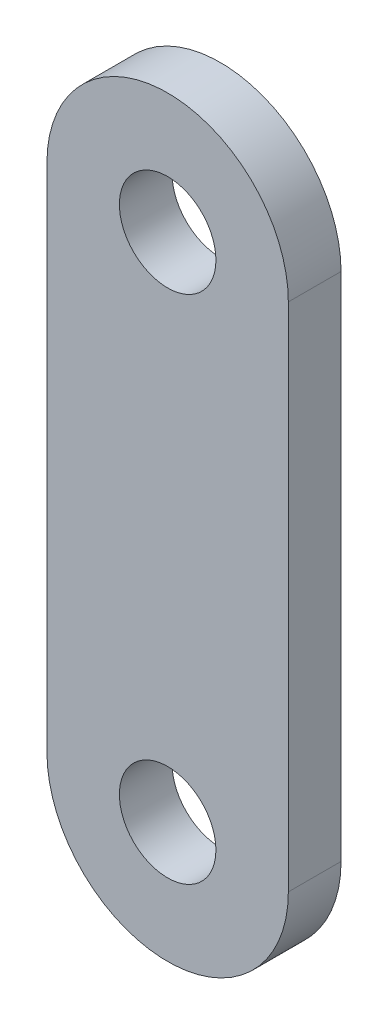
ISO-10303-21;
HEADER;
FILE_DESCRIPTION(('STEP AP214'),'2;1');
FILE_NAME('part.step','',(''),(''),'','','');
FILE_SCHEMA(('AUTOMOTIVE_DESIGN { 1 0 10303 214 1 1 1 1 }'));
ENDSEC;
DATA;
#1=APPLICATION_CONTEXT('core data for automotive mechanical design processes');
#2=APPLICATION_PROTOCOL_DEFINITION('international standard','automotive_design',2000,#1);
#3=PRODUCT_CONTEXT('',#1,'mechanical');
#4=PRODUCT('Part','Part','',(#3));
#5=PRODUCT_RELATED_PRODUCT_CATEGORY('part','',(#4));
#6=PRODUCT_DEFINITION_FORMATION('','',#4);
#7=PRODUCT_DEFINITION_CONTEXT('part definition',#1,'design');
#8=PRODUCT_DEFINITION('design','',#6,#7);
#9=PRODUCT_DEFINITION_SHAPE('','',#8);
#10=(LENGTH_UNIT() NAMED_UNIT(*) SI_UNIT(.MILLI.,.METRE.));
#11=(NAMED_UNIT(*) PLANE_ANGLE_UNIT() SI_UNIT($,.RADIAN.));
#12=(NAMED_UNIT(*) SI_UNIT($,.STERADIAN.) SOLID_ANGLE_UNIT());
#13=UNCERTAINTY_MEASURE_WITH_UNIT(LENGTH_MEASURE(1.E-05),#10,'distance_accuracy_value','');
#14=(GEOMETRIC_REPRESENTATION_CONTEXT(3) GLOBAL_UNCERTAINTY_ASSIGNED_CONTEXT((#13)) GLOBAL_UNIT_ASSIGNED_CONTEXT((#10,
#11,#12)) REPRESENTATION_CONTEXT('',''));
#15=CARTESIAN_POINT('',(0.,0.,0.));
#16=DIRECTION('',(0.,0.,1.));
#17=DIRECTION('',(1.,0.,0.));
#18=AXIS2_PLACEMENT_3D('',#15,#16,#17);
#19=CARTESIAN_POINT('',(0.,-6.35,1.31));
#20=DIRECTION('',(0.,0.,1.));
#21=DIRECTION('',(1.,0.,0.));
#22=AXIS2_PLACEMENT_3D('',#19,#20,#21);
#23=PLANE('',#22);
#24=CARTESIAN_POINT('',(0.,6.35,1.31));
#25=DIRECTION('',(0.,0.,1.));
#26=DIRECTION('',(1.,0.,0.));
#27=AXIS2_PLACEMENT_3D('',#24,#25,#26);
#28=CIRCLE('',#27,1.2);
#29=CARTESIAN_POINT('',(1.19999999999998,6.35,1.31));
#30=VERTEX_POINT('',#29);
#31=EDGE_CURVE('E102',#30,#30,#28,.T.);
#32=ORIENTED_EDGE('',*,*,#31,.F.);
#33=EDGE_LOOP('',(#32));
#34=FACE_BOUND('',#33,.T.);
#35=CARTESIAN_POINT('',(0.,-6.35,1.31));
#36=DIRECTION('',(0.,0.,1.));
#37=DIRECTION('',(1.,0.,0.));
#38=AXIS2_PLACEMENT_3D('',#35,#36,#37);
#39=CIRCLE('',#38,3.);
#40=CARTESIAN_POINT('',(-3.,-6.35,1.31));
#41=VERTEX_POINT('',#40);
#42=CARTESIAN_POINT('',(3.,-6.35,1.31));
#43=VERTEX_POINT('',#42);
#44=EDGE_CURVE('E87',#41,#43,#39,.T.);
#45=ORIENTED_EDGE('',*,*,#44,.T.);
#46=DIRECTION('',(0.,1.,0.));
#47=VECTOR('',#46,1.);
#48=CARTESIAN_POINT('',(3.,-6.35,1.31));
#49=LINE('',#48,#47);
#50=CARTESIAN_POINT('',(2.99999999999998,6.35,1.31));
#51=VERTEX_POINT('',#50);
#52=EDGE_CURVE('E82',#43,#51,#49,.T.);
#53=ORIENTED_EDGE('',*,*,#52,.T.);
#54=CARTESIAN_POINT('',(0.,6.35,1.31));
#55=DIRECTION('',(0.,0.,1.));
#56=DIRECTION('',(1.,0.,0.));
#57=AXIS2_PLACEMENT_3D('',#54,#55,#56);
#58=CIRCLE('',#57,3.);
#59=CARTESIAN_POINT('',(-3.,6.35,1.31));
#60=VERTEX_POINT('',#59);
#61=EDGE_CURVE('E85',#51,#60,#58,.T.);
#62=ORIENTED_EDGE('',*,*,#61,.T.);
#63=DIRECTION('',(0.,-1.,0.));
#64=VECTOR('',#63,1.);
#65=CARTESIAN_POINT('',(-3.,-6.35,1.31));
#66=LINE('',#65,#64);
#67=EDGE_CURVE('E52',#60,#41,#66,.T.);
#68=ORIENTED_EDGE('',*,*,#67,.T.);
#69=EDGE_LOOP('',(#45,#53,#62,#68));
#70=FACE_BOUND('',#69,.T.);
#71=CARTESIAN_POINT('',(0.,-6.35,1.31));
#72=DIRECTION('',(0.,0.,1.));
#73=DIRECTION('',(1.,0.,0.));
#74=AXIS2_PLACEMENT_3D('',#71,#72,#73);
#75=CIRCLE('',#74,1.2);
#76=CARTESIAN_POINT('',(1.20000000000002,-6.35,1.31));
#77=VERTEX_POINT('',#76);
#78=EDGE_CURVE('E117',#77,#77,#75,.T.);
#79=ORIENTED_EDGE('',*,*,#78,.F.);
#80=EDGE_LOOP('',(#79));
#81=FACE_BOUND('',#80,.T.);
#82=ADVANCED_FACE('F35',(#34,#70,#81),#23,.T.);
#83=CARTESIAN_POINT('',(0.,-6.35,0.));
#84=DIRECTION('',(0.,0.,1.));
#85=DIRECTION('',(1.,0.,0.));
#86=AXIS2_PLACEMENT_3D('',#83,#84,#85);
#87=PLANE('',#86);
#88=CARTESIAN_POINT('',(0.,-6.35,0.));
#89=DIRECTION('',(0.,0.,1.));
#90=DIRECTION('',(1.,0.,0.));
#91=AXIS2_PLACEMENT_3D('',#88,#89,#90);
#92=CIRCLE('',#91,3.);
#93=CARTESIAN_POINT('',(-3.,-6.35,0.));
#94=VERTEX_POINT('',#93);
#95=CARTESIAN_POINT('',(3.,-6.35,0.));
#96=VERTEX_POINT('',#95);
#97=EDGE_CURVE('E99',#94,#96,#92,.T.);
#98=ORIENTED_EDGE('',*,*,#97,.F.);
#99=DIRECTION('',(0.,-1.,0.));
#100=VECTOR('',#99,1.);
#101=CARTESIAN_POINT('',(-3.,-6.35,0.));
#102=LINE('',#101,#100);
#103=CARTESIAN_POINT('',(-3.,6.35,0.));
#104=VERTEX_POINT('',#103);
#105=EDGE_CURVE('E75',#104,#94,#102,.T.);
#106=ORIENTED_EDGE('',*,*,#105,.F.);
#107=CARTESIAN_POINT('',(0.,6.35,0.));
#108=DIRECTION('',(0.,0.,1.));
#109=DIRECTION('',(1.,0.,0.));
#110=AXIS2_PLACEMENT_3D('',#107,#108,#109);
#111=CIRCLE('',#110,3.);
#112=CARTESIAN_POINT('',(2.99999999999998,6.35,0.));
#113=VERTEX_POINT('',#112);
#114=EDGE_CURVE('E69',#113,#104,#111,.T.);
#115=ORIENTED_EDGE('',*,*,#114,.F.);
#116=DIRECTION('',(0.,1.,0.));
#117=VECTOR('',#116,1.);
#118=CARTESIAN_POINT('',(3.,-6.35,0.));
#119=LINE('',#118,#117);
#120=EDGE_CURVE('E91',#96,#113,#119,.T.);
#121=ORIENTED_EDGE('',*,*,#120,.F.);
#122=EDGE_LOOP('',(#98,#106,#115,#121));
#123=FACE_BOUND('',#122,.T.);
#124=CARTESIAN_POINT('',(0.,6.35,0.));
#125=DIRECTION('',(0.,0.,1.));
#126=DIRECTION('',(1.,0.,0.));
#127=AXIS2_PLACEMENT_3D('',#124,#125,#126);
#128=CIRCLE('',#127,1.2);
#129=CARTESIAN_POINT('',(1.19999999999998,6.35,0.));
#130=VERTEX_POINT('',#129);
#131=EDGE_CURVE('E114',#130,#130,#128,.T.);
#132=ORIENTED_EDGE('',*,*,#131,.T.);
#133=EDGE_LOOP('',(#132));
#134=FACE_BOUND('',#133,.T.);
#135=CARTESIAN_POINT('',(0.,-6.35,0.));
#136=DIRECTION('',(0.,0.,1.));
#137=DIRECTION('',(1.,0.,0.));
#138=AXIS2_PLACEMENT_3D('',#135,#136,#137);
#139=CIRCLE('',#138,1.2);
#140=CARTESIAN_POINT('',(1.20000000000002,-6.35,0.));
#141=VERTEX_POINT('',#140);
#142=EDGE_CURVE('E120',#141,#141,#139,.T.);
#143=ORIENTED_EDGE('',*,*,#142,.T.);
#144=EDGE_LOOP('',(#143));
#145=FACE_BOUND('',#144,.T.);
#146=ADVANCED_FACE('F110',(#123,#134,#145),#87,.F.);
#147=CARTESIAN_POINT('',(0.,-6.35,1.31));
#148=DIRECTION('',(0.,0.,-1.));
#149=DIRECTION('',(-1.,0.,0.));
#150=AXIS2_PLACEMENT_3D('',#147,#148,#149);
#151=CYLINDRICAL_SURFACE('',#150,3.);
#152=ORIENTED_EDGE('',*,*,#97,.T.);
#153=DIRECTION('',(0.,0.,-1.));
#154=VECTOR('',#153,1.);
#155=CARTESIAN_POINT('',(3.,-6.35,1.31));
#156=LINE('',#155,#154);
#157=EDGE_CURVE('E11',#43,#96,#156,.T.);
#158=ORIENTED_EDGE('',*,*,#157,.F.);
#159=ORIENTED_EDGE('',*,*,#44,.F.);
#160=DIRECTION('',(0.,0.,-1.));
#161=VECTOR('',#160,1.);
#162=CARTESIAN_POINT('',(-3.,-6.35,1.31));
#163=LINE('',#162,#161);
#164=EDGE_CURVE('E95',#41,#94,#163,.T.);
#165=ORIENTED_EDGE('',*,*,#164,.T.);
#166=EDGE_LOOP('',(#152,#158,#159,#165));
#167=FACE_BOUND('',#166,.T.);
#168=ADVANCED_FACE('F37',(#167),#151,.T.);
#169=CARTESIAN_POINT('',(3.,-6.35,1.31));
#170=DIRECTION('',(-1.,0.,0.));
#171=DIRECTION('',(0.,-1.,0.));
#172=AXIS2_PLACEMENT_3D('',#169,#170,#171);
#173=PLANE('',#172);
#174=ORIENTED_EDGE('',*,*,#120,.T.);
#175=DIRECTION('',(0.,0.,-1.));
#176=VECTOR('',#175,1.);
#177=CARTESIAN_POINT('',(2.99999999999998,6.35,1.31));
#178=LINE('',#177,#176);
#179=EDGE_CURVE('E44',#51,#113,#178,.T.);
#180=ORIENTED_EDGE('',*,*,#179,.F.);
#181=ORIENTED_EDGE('',*,*,#52,.F.);
#182=ORIENTED_EDGE('',*,*,#157,.T.);
#183=EDGE_LOOP('',(#174,#180,#181,#182));
#184=FACE_BOUND('',#183,.T.);
#185=ADVANCED_FACE('F90',(#184),#173,.F.);
#186=CARTESIAN_POINT('',(0.,6.35,1.31));
#187=DIRECTION('',(0.,0.,-1.));
#188=DIRECTION('',(-1.,0.,0.));
#189=AXIS2_PLACEMENT_3D('',#186,#187,#188);
#190=CYLINDRICAL_SURFACE('',#189,3.);
#191=ORIENTED_EDGE('',*,*,#114,.T.);
#192=DIRECTION('',(0.,0.,-1.));
#193=VECTOR('',#192,1.);
#194=CARTESIAN_POINT('',(-3.,6.35,1.31));
#195=LINE('',#194,#193);
#196=EDGE_CURVE('E92',#60,#104,#195,.T.);
#197=ORIENTED_EDGE('',*,*,#196,.F.);
#198=ORIENTED_EDGE('',*,*,#61,.F.);
#199=ORIENTED_EDGE('',*,*,#179,.T.);
#200=EDGE_LOOP('',(#191,#197,#198,#199));
#201=FACE_BOUND('',#200,.T.);
#202=ADVANCED_FACE('F93',(#201),#190,.T.);
#203=CARTESIAN_POINT('',(-3.,-6.35,1.31));
#204=DIRECTION('',(1.,0.,0.));
#205=DIRECTION('',(0.,1.,0.));
#206=AXIS2_PLACEMENT_3D('',#203,#204,#205);
#207=PLANE('',#206);
#208=ORIENTED_EDGE('',*,*,#105,.T.);
#209=ORIENTED_EDGE('',*,*,#164,.F.);
#210=ORIENTED_EDGE('',*,*,#67,.F.);
#211=ORIENTED_EDGE('',*,*,#196,.T.);
#212=EDGE_LOOP('',(#208,#209,#210,#211));
#213=FACE_BOUND('',#212,.T.);
#214=ADVANCED_FACE('F107',(#213),#207,.F.);
#215=CARTESIAN_POINT('',(0.,6.35,1.31));
#216=DIRECTION('',(0.,0.,-1.));
#217=DIRECTION('',(-1.,0.,0.));
#218=AXIS2_PLACEMENT_3D('',#215,#216,#217);
#219=CYLINDRICAL_SURFACE('',#218,1.2);
#220=ORIENTED_EDGE('',*,*,#31,.T.);
#221=EDGE_LOOP('',(#220));
#222=FACE_BOUND('',#221,.T.);
#223=ORIENTED_EDGE('',*,*,#131,.F.);
#224=EDGE_LOOP('',(#223));
#225=FACE_BOUND('',#224,.T.);
#226=ADVANCED_FACE('F137',(#222,#225),#219,.F.);
#227=CARTESIAN_POINT('',(0.,-6.35,1.31));
#228=DIRECTION('',(0.,0.,-1.));
#229=DIRECTION('',(-1.,0.,0.));
#230=AXIS2_PLACEMENT_3D('',#227,#228,#229);
#231=CYLINDRICAL_SURFACE('',#230,1.2);
#232=ORIENTED_EDGE('',*,*,#78,.T.);
#233=EDGE_LOOP('',(#232));
#234=FACE_BOUND('',#233,.T.);
#235=ORIENTED_EDGE('',*,*,#142,.F.);
#236=EDGE_LOOP('',(#235));
#237=FACE_BOUND('',#236,.T.);
#238=ADVANCED_FACE('F126',(#234,#237),#231,.F.);
#239=CLOSED_SHELL('',(#82,#146,#168,#185,#202,#214,#226,#238));
#240=MANIFOLD_SOLID_BREP('B2',#239);
#241=ADVANCED_BREP_SHAPE_REPRESENTATION('',(#18,#240),#14);
#242=SHAPE_DEFINITION_REPRESENTATION(#9,#241);
ENDSEC;
END-ISO-10303-21;
